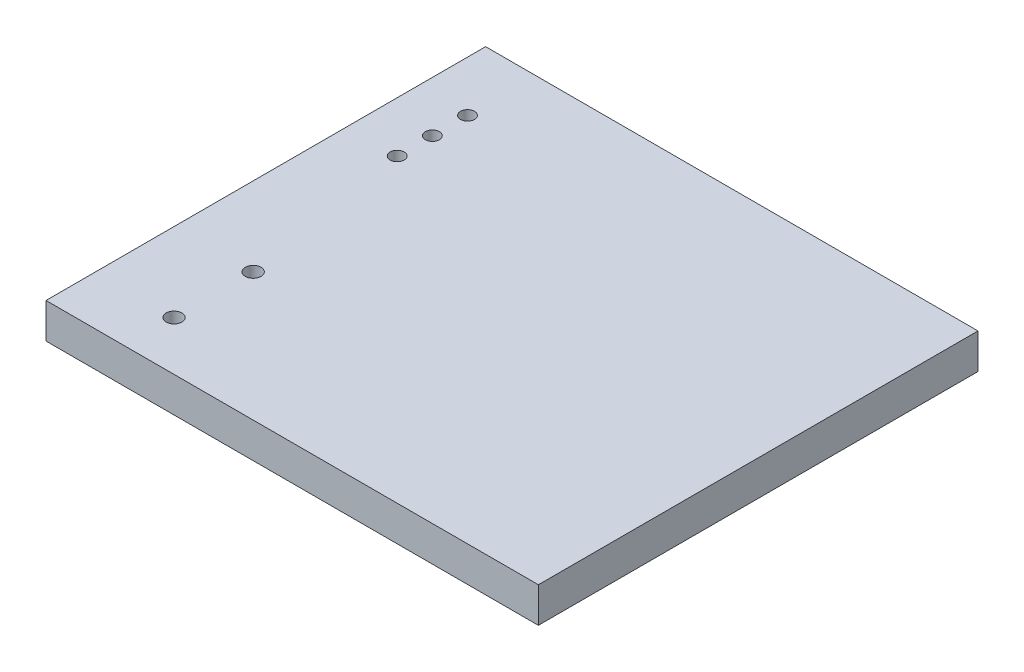
ISO-10303-21;
HEADER;
FILE_DESCRIPTION(('STEP AP214'),'2;1');
FILE_NAME('part.step','',(''),(''),'','','');
FILE_SCHEMA(('AUTOMOTIVE_DESIGN { 1 0 10303 214 1 1 1 1 }'));
ENDSEC;
DATA;
#1=APPLICATION_CONTEXT('core data for automotive mechanical design processes');
#2=APPLICATION_PROTOCOL_DEFINITION('international standard','automotive_design',2000,#1);
#3=PRODUCT_CONTEXT('',#1,'mechanical');
#4=PRODUCT('Part','Part','',(#3));
#5=PRODUCT_RELATED_PRODUCT_CATEGORY('part','',(#4));
#6=PRODUCT_DEFINITION_FORMATION('','',#4);
#7=PRODUCT_DEFINITION_CONTEXT('part definition',#1,'design');
#8=PRODUCT_DEFINITION('design','',#6,#7);
#9=PRODUCT_DEFINITION_SHAPE('','',#8);
#10=(LENGTH_UNIT() NAMED_UNIT(*) SI_UNIT(.MILLI.,.METRE.));
#11=(NAMED_UNIT(*) PLANE_ANGLE_UNIT() SI_UNIT($,.RADIAN.));
#12=(NAMED_UNIT(*) SI_UNIT($,.STERADIAN.) SOLID_ANGLE_UNIT());
#13=UNCERTAINTY_MEASURE_WITH_UNIT(LENGTH_MEASURE(1.E-05),#10,'distance_accuracy_value','');
#14=(GEOMETRIC_REPRESENTATION_CONTEXT(3) GLOBAL_UNCERTAINTY_ASSIGNED_CONTEXT((#13)) GLOBAL_UNIT_ASSIGNED_CONTEXT((#10,
#11,#12)) REPRESENTATION_CONTEXT('',''));
#15=CARTESIAN_POINT('',(0.,0.,0.));
#16=DIRECTION('',(0.,0.,1.));
#17=DIRECTION('',(1.,0.,0.));
#18=AXIS2_PLACEMENT_3D('',#15,#16,#17);
#19=CARTESIAN_POINT('',(0.,2.,0.));
#20=DIRECTION('',(0.,-1.,0.));
#21=DIRECTION('',(0.,0.,-1.));
#22=AXIS2_PLACEMENT_3D('',#19,#20,#21);
#23=PLANE('',#22);
#24=CARTESIAN_POINT('',(-11.13,2.,-8.6));
#25=DIRECTION('',(0.,-1.,0.));
#26=DIRECTION('',(0.,0.,-1.));
#27=AXIS2_PLACEMENT_3D('',#24,#25,#26);
#28=CIRCLE('',#27,0.399999999999999);
#29=CARTESIAN_POINT('',(-11.13,2.,-9.));
#30=VERTEX_POINT('',#29);
#31=EDGE_CURVE('E131',#30,#30,#28,.F.);
#32=ORIENTED_EDGE('',*,*,#31,.F.);
#33=EDGE_LOOP('',(#32));
#34=FACE_BOUND('',#33,.T.);
#35=CARTESIAN_POINT('',(-9.52000000000001,2.,9.7));
#36=DIRECTION('',(0.,-1.,0.));
#37=DIRECTION('',(0.,0.,-1.));
#38=AXIS2_PLACEMENT_3D('',#35,#36,#37);
#39=CIRCLE('',#38,0.45);
#40=CARTESIAN_POINT('',(-9.52000000000001,2.,9.25));
#41=VERTEX_POINT('',#40);
#42=EDGE_CURVE('E119',#41,#41,#39,.F.);
#43=ORIENTED_EDGE('',*,*,#42,.F.);
#44=EDGE_LOOP('',(#43));
#45=FACE_BOUND('',#44,.T.);
#46=DIRECTION('',(0.,0.,-1.));
#47=VECTOR('',#46,1.);
#48=CARTESIAN_POINT('',(14.,2.,12.5));
#49=LINE('',#48,#47);
#50=CARTESIAN_POINT('',(14.,2.,12.5));
#51=VERTEX_POINT('',#50);
#52=CARTESIAN_POINT('',(14.,2.,-12.5));
#53=VERTEX_POINT('',#52);
#54=EDGE_CURVE('E87',#51,#53,#49,.T.);
#55=ORIENTED_EDGE('',*,*,#54,.T.);
#56=DIRECTION('',(-1.,0.,0.));
#57=VECTOR('',#56,1.);
#58=CARTESIAN_POINT('',(-14.,2.,-12.5));
#59=LINE('',#58,#57);
#60=CARTESIAN_POINT('',(-14.,2.,-12.5));
#61=VERTEX_POINT('',#60);
#62=EDGE_CURVE('E82',#53,#61,#59,.T.);
#63=ORIENTED_EDGE('',*,*,#62,.T.);
#64=DIRECTION('',(0.,0.,1.));
#65=VECTOR('',#64,1.);
#66=CARTESIAN_POINT('',(-14.,2.,12.5));
#67=LINE('',#66,#65);
#68=CARTESIAN_POINT('',(-14.,2.,12.5));
#69=VERTEX_POINT('',#68);
#70=EDGE_CURVE('E85',#61,#69,#67,.T.);
#71=ORIENTED_EDGE('',*,*,#70,.T.);
#72=DIRECTION('',(1.,0.,0.));
#73=VECTOR('',#72,1.);
#74=CARTESIAN_POINT('',(-14.,2.,12.5));
#75=LINE('',#74,#73);
#76=EDGE_CURVE('E52',#69,#51,#75,.T.);
#77=ORIENTED_EDGE('',*,*,#76,.T.);
#78=EDGE_LOOP('',(#55,#63,#71,#77));
#79=FACE_BOUND('',#78,.T.);
#80=CARTESIAN_POINT('',(-9.52000000000001,2.,5.2));
#81=DIRECTION('',(0.,-1.,0.));
#82=DIRECTION('',(0.,0.,-1.));
#83=AXIS2_PLACEMENT_3D('',#80,#81,#82);
#84=CIRCLE('',#83,0.45);
#85=CARTESIAN_POINT('',(-9.52000000000001,2.,4.75));
#86=VERTEX_POINT('',#85);
#87=EDGE_CURVE('E102',#86,#86,#84,.F.);
#88=ORIENTED_EDGE('',*,*,#87,.F.);
#89=EDGE_LOOP('',(#88));
#90=FACE_BOUND('',#89,.T.);
#91=CARTESIAN_POINT('',(-11.13,2.,-6.6));
#92=DIRECTION('',(0.,-1.,0.));
#93=DIRECTION('',(0.,0.,-1.));
#94=AXIS2_PLACEMENT_3D('',#91,#92,#93);
#95=CIRCLE('',#94,0.4);
#96=CARTESIAN_POINT('',(-11.13,2.,-7.));
#97=VERTEX_POINT('',#96);
#98=EDGE_CURVE('E125',#97,#97,#95,.F.);
#99=ORIENTED_EDGE('',*,*,#98,.F.);
#100=EDGE_LOOP('',(#99));
#101=FACE_BOUND('',#100,.T.);
#102=CARTESIAN_POINT('',(-11.13,2.,-4.6));
#103=DIRECTION('',(0.,-1.,0.));
#104=DIRECTION('',(0.,0.,-1.));
#105=AXIS2_PLACEMENT_3D('',#102,#103,#104);
#106=CIRCLE('',#105,0.4);
#107=CARTESIAN_POINT('',(-11.13,2.,-5.));
#108=VERTEX_POINT('',#107);
#109=EDGE_CURVE('E137',#108,#108,#106,.F.);
#110=ORIENTED_EDGE('',*,*,#109,.F.);
#111=EDGE_LOOP('',(#110));
#112=FACE_BOUND('',#111,.T.);
#113=ADVANCED_FACE('F35',(#34,#45,#79,#90,#101,#112),#23,.F.);
#114=CARTESIAN_POINT('',(0.,0.,0.));
#115=DIRECTION('',(0.,-1.,0.));
#116=DIRECTION('',(0.,0.,-1.));
#117=AXIS2_PLACEMENT_3D('',#114,#115,#116);
#118=PLANE('',#117);
#119=CARTESIAN_POINT('',(-11.13,0.,-8.6));
#120=DIRECTION('',(0.,1.,0.));
#121=DIRECTION('',(0.,0.,1.));
#122=AXIS2_PLACEMENT_3D('',#119,#120,#121);
#123=CIRCLE('',#122,0.399999999999999);
#124=CARTESIAN_POINT('',(-11.13,0.,-8.2));
#125=VERTEX_POINT('',#124);
#126=EDGE_CURVE('E134',#125,#125,#123,.T.);
#127=ORIENTED_EDGE('',*,*,#126,.T.);
#128=EDGE_LOOP('',(#127));
#129=FACE_BOUND('',#128,.T.);
#130=CARTESIAN_POINT('',(-9.52000000000001,0.,9.7));
#131=DIRECTION('',(0.,1.,0.));
#132=DIRECTION('',(0.,0.,1.));
#133=AXIS2_PLACEMENT_3D('',#130,#131,#132);
#134=CIRCLE('',#133,0.45);
#135=CARTESIAN_POINT('',(-9.52000000000001,0.,10.15));
#136=VERTEX_POINT('',#135);
#137=EDGE_CURVE('E122',#136,#136,#134,.T.);
#138=ORIENTED_EDGE('',*,*,#137,.T.);
#139=EDGE_LOOP('',(#138));
#140=FACE_BOUND('',#139,.T.);
#141=DIRECTION('',(0.,0.,-1.));
#142=VECTOR('',#141,1.);
#143=CARTESIAN_POINT('',(14.,0.,12.5));
#144=LINE('',#143,#142);
#145=CARTESIAN_POINT('',(14.,0.,12.5));
#146=VERTEX_POINT('',#145);
#147=CARTESIAN_POINT('',(14.,0.,-12.5));
#148=VERTEX_POINT('',#147);
#149=EDGE_CURVE('E99',#146,#148,#144,.T.);
#150=ORIENTED_EDGE('',*,*,#149,.F.);
#151=DIRECTION('',(1.,0.,0.));
#152=VECTOR('',#151,1.);
#153=CARTESIAN_POINT('',(-14.,0.,12.5));
#154=LINE('',#153,#152);
#155=CARTESIAN_POINT('',(-14.,0.,12.5));
#156=VERTEX_POINT('',#155);
#157=EDGE_CURVE('E75',#156,#146,#154,.T.);
#158=ORIENTED_EDGE('',*,*,#157,.F.);
#159=DIRECTION('',(0.,0.,1.));
#160=VECTOR('',#159,1.);
#161=CARTESIAN_POINT('',(-14.,0.,12.5));
#162=LINE('',#161,#160);
#163=CARTESIAN_POINT('',(-14.,0.,-12.5));
#164=VERTEX_POINT('',#163);
#165=EDGE_CURVE('E69',#164,#156,#162,.T.);
#166=ORIENTED_EDGE('',*,*,#165,.F.);
#167=DIRECTION('',(-1.,0.,0.));
#168=VECTOR('',#167,1.);
#169=CARTESIAN_POINT('',(-14.,0.,-12.5));
#170=LINE('',#169,#168);
#171=EDGE_CURVE('E91',#148,#164,#170,.T.);
#172=ORIENTED_EDGE('',*,*,#171,.F.);
#173=EDGE_LOOP('',(#150,#158,#166,#172));
#174=FACE_BOUND('',#173,.T.);
#175=CARTESIAN_POINT('',(-9.52000000000001,0.,5.2));
#176=DIRECTION('',(0.,1.,0.));
#177=DIRECTION('',(0.,0.,1.));
#178=AXIS2_PLACEMENT_3D('',#175,#176,#177);
#179=CIRCLE('',#178,0.45);
#180=CARTESIAN_POINT('',(-9.52000000000001,0.,5.65));
#181=VERTEX_POINT('',#180);
#182=EDGE_CURVE('E116',#181,#181,#179,.T.);
#183=ORIENTED_EDGE('',*,*,#182,.T.);
#184=EDGE_LOOP('',(#183));
#185=FACE_BOUND('',#184,.T.);
#186=CARTESIAN_POINT('',(-11.13,0.,-6.6));
#187=DIRECTION('',(0.,1.,0.));
#188=DIRECTION('',(0.,0.,1.));
#189=AXIS2_PLACEMENT_3D('',#186,#187,#188);
#190=CIRCLE('',#189,0.4);
#191=CARTESIAN_POINT('',(-11.13,0.,-6.2));
#192=VERTEX_POINT('',#191);
#193=EDGE_CURVE('E128',#192,#192,#190,.T.);
#194=ORIENTED_EDGE('',*,*,#193,.T.);
#195=EDGE_LOOP('',(#194));
#196=FACE_BOUND('',#195,.T.);
#197=CARTESIAN_POINT('',(-11.13,0.,-4.6));
#198=DIRECTION('',(0.,1.,0.));
#199=DIRECTION('',(0.,0.,1.));
#200=AXIS2_PLACEMENT_3D('',#197,#198,#199);
#201=CIRCLE('',#200,0.4);
#202=CARTESIAN_POINT('',(-11.13,0.,-4.2));
#203=VERTEX_POINT('',#202);
#204=EDGE_CURVE('E140',#203,#203,#201,.T.);
#205=ORIENTED_EDGE('',*,*,#204,.T.);
#206=EDGE_LOOP('',(#205));
#207=FACE_BOUND('',#206,.T.);
#208=ADVANCED_FACE('F110',(#129,#140,#174,#185,#196,#207),#118,.T.);
#209=CARTESIAN_POINT('',(14.,2.,12.5));
#210=DIRECTION('',(-1.,0.,0.));
#211=DIRECTION('',(0.,0.,1.));
#212=AXIS2_PLACEMENT_3D('',#209,#210,#211);
#213=PLANE('',#212);
#214=ORIENTED_EDGE('',*,*,#149,.T.);
#215=DIRECTION('',(0.,-1.,0.));
#216=VECTOR('',#215,1.);
#217=CARTESIAN_POINT('',(14.,2.,-12.5));
#218=LINE('',#217,#216);
#219=EDGE_CURVE('E11',#53,#148,#218,.T.);
#220=ORIENTED_EDGE('',*,*,#219,.F.);
#221=ORIENTED_EDGE('',*,*,#54,.F.);
#222=DIRECTION('',(0.,-1.,0.));
#223=VECTOR('',#222,1.);
#224=CARTESIAN_POINT('',(14.,2.,12.5));
#225=LINE('',#224,#223);
#226=EDGE_CURVE('E95',#51,#146,#225,.T.);
#227=ORIENTED_EDGE('',*,*,#226,.T.);
#228=EDGE_LOOP('',(#214,#220,#221,#227));
#229=FACE_BOUND('',#228,.T.);
#230=ADVANCED_FACE('F37',(#229),#213,.F.);
#231=CARTESIAN_POINT('',(-14.,2.,-12.5));
#232=DIRECTION('',(0.,0.,1.));
#233=DIRECTION('',(1.,0.,0.));
#234=AXIS2_PLACEMENT_3D('',#231,#232,#233);
#235=PLANE('',#234);
#236=ORIENTED_EDGE('',*,*,#171,.T.);
#237=DIRECTION('',(0.,-1.,0.));
#238=VECTOR('',#237,1.);
#239=CARTESIAN_POINT('',(-14.,2.,-12.5));
#240=LINE('',#239,#238);
#241=EDGE_CURVE('E44',#61,#164,#240,.T.);
#242=ORIENTED_EDGE('',*,*,#241,.F.);
#243=ORIENTED_EDGE('',*,*,#62,.F.);
#244=ORIENTED_EDGE('',*,*,#219,.T.);
#245=EDGE_LOOP('',(#236,#242,#243,#244));
#246=FACE_BOUND('',#245,.T.);
#247=ADVANCED_FACE('F90',(#246),#235,.F.);
#248=CARTESIAN_POINT('',(-14.,2.,12.5));
#249=DIRECTION('',(1.,0.,0.));
#250=DIRECTION('',(0.,0.,-1.));
#251=AXIS2_PLACEMENT_3D('',#248,#249,#250);
#252=PLANE('',#251);
#253=ORIENTED_EDGE('',*,*,#165,.T.);
#254=DIRECTION('',(0.,-1.,0.));
#255=VECTOR('',#254,1.);
#256=CARTESIAN_POINT('',(-14.,2.,12.5));
#257=LINE('',#256,#255);
#258=EDGE_CURVE('E92',#69,#156,#257,.T.);
#259=ORIENTED_EDGE('',*,*,#258,.F.);
#260=ORIENTED_EDGE('',*,*,#70,.F.);
#261=ORIENTED_EDGE('',*,*,#241,.T.);
#262=EDGE_LOOP('',(#253,#259,#260,#261));
#263=FACE_BOUND('',#262,.T.);
#264=ADVANCED_FACE('F93',(#263),#252,.F.);
#265=CARTESIAN_POINT('',(-14.,2.,12.5));
#266=DIRECTION('',(0.,0.,-1.));
#267=DIRECTION('',(-1.,0.,0.));
#268=AXIS2_PLACEMENT_3D('',#265,#266,#267);
#269=PLANE('',#268);
#270=ORIENTED_EDGE('',*,*,#157,.T.);
#271=ORIENTED_EDGE('',*,*,#226,.F.);
#272=ORIENTED_EDGE('',*,*,#76,.F.);
#273=ORIENTED_EDGE('',*,*,#258,.T.);
#274=EDGE_LOOP('',(#270,#271,#272,#273));
#275=FACE_BOUND('',#274,.T.);
#276=ADVANCED_FACE('F107',(#275),#269,.F.);
#277=CARTESIAN_POINT('',(-9.52000000000001,10.,5.2));
#278=DIRECTION('',(0.,-1.,0.));
#279=DIRECTION('',(0.,0.,-1.));
#280=AXIS2_PLACEMENT_3D('',#277,#278,#279);
#281=CYLINDRICAL_SURFACE('',#280,0.45);
#282=ORIENTED_EDGE('',*,*,#182,.F.);
#283=EDGE_LOOP('',(#282));
#284=FACE_BOUND('',#283,.T.);
#285=ORIENTED_EDGE('',*,*,#87,.T.);
#286=EDGE_LOOP('',(#285));
#287=FACE_BOUND('',#286,.T.);
#288=ADVANCED_FACE('F164',(#284,#287),#281,.F.);
#289=CARTESIAN_POINT('',(-9.52000000000001,10.,9.7));
#290=DIRECTION('',(0.,-1.,0.));
#291=DIRECTION('',(0.,0.,-1.));
#292=AXIS2_PLACEMENT_3D('',#289,#290,#291);
#293=CYLINDRICAL_SURFACE('',#292,0.45);
#294=ORIENTED_EDGE('',*,*,#137,.F.);
#295=EDGE_LOOP('',(#294));
#296=FACE_BOUND('',#295,.T.);
#297=ORIENTED_EDGE('',*,*,#42,.T.);
#298=EDGE_LOOP('',(#297));
#299=FACE_BOUND('',#298,.T.);
#300=ADVANCED_FACE('F201',(#296,#299),#293,.F.);
#301=CARTESIAN_POINT('',(-11.13,2.5,-6.6));
#302=DIRECTION('',(0.,-1.,0.));
#303=DIRECTION('',(0.,0.,-1.));
#304=AXIS2_PLACEMENT_3D('',#301,#302,#303);
#305=CYLINDRICAL_SURFACE('',#304,0.4);
#306=ORIENTED_EDGE('',*,*,#193,.F.);
#307=EDGE_LOOP('',(#306));
#308=FACE_BOUND('',#307,.T.);
#309=ORIENTED_EDGE('',*,*,#98,.T.);
#310=EDGE_LOOP('',(#309));
#311=FACE_BOUND('',#310,.T.);
#312=ADVANCED_FACE('F210',(#308,#311),#305,.F.);
#313=CARTESIAN_POINT('',(-11.13,2.5,-8.6));
#314=DIRECTION('',(0.,-1.,0.));
#315=DIRECTION('',(0.,0.,-1.));
#316=AXIS2_PLACEMENT_3D('',#313,#314,#315);
#317=CYLINDRICAL_SURFACE('',#316,0.399999999999999);
#318=ORIENTED_EDGE('',*,*,#126,.F.);
#319=EDGE_LOOP('',(#318));
#320=FACE_BOUND('',#319,.T.);
#321=ORIENTED_EDGE('',*,*,#31,.T.);
#322=EDGE_LOOP('',(#321));
#323=FACE_BOUND('',#322,.T.);
#324=ADVANCED_FACE('F148',(#320,#323),#317,.F.);
#325=CARTESIAN_POINT('',(-11.13,2.5,-4.6));
#326=DIRECTION('',(0.,-1.,0.));
#327=DIRECTION('',(0.,0.,-1.));
#328=AXIS2_PLACEMENT_3D('',#325,#326,#327);
#329=CYLINDRICAL_SURFACE('',#328,0.4);
#330=ORIENTED_EDGE('',*,*,#204,.F.);
#331=EDGE_LOOP('',(#330));
#332=FACE_BOUND('',#331,.T.);
#333=ORIENTED_EDGE('',*,*,#109,.T.);
#334=EDGE_LOOP('',(#333));
#335=FACE_BOUND('',#334,.T.);
#336=ADVANCED_FACE('F145',(#332,#335),#329,.F.);
#337=CLOSED_SHELL('',(#113,#208,#230,#247,#264,#276,#288,#300,#312,#324,#336));
#338=MANIFOLD_SOLID_BREP('B2',#337);
#339=ADVANCED_BREP_SHAPE_REPRESENTATION('',(#18,#338),#14);
#340=SHAPE_DEFINITION_REPRESENTATION(#9,#339);
ENDSEC;
END-ISO-10303-21;
